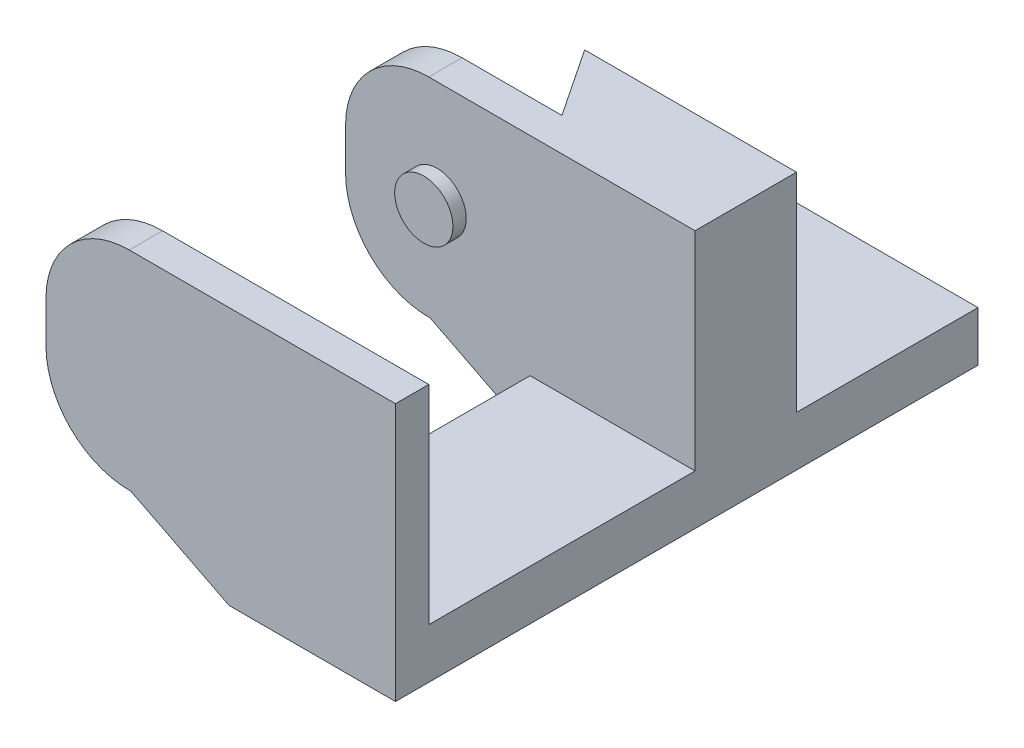
ISO-10303-21;
HEADER;
FILE_DESCRIPTION(('STEP AP214'),'2;1');
FILE_NAME('part.step','',(''),(''),'','','');
FILE_SCHEMA(('AUTOMOTIVE_DESIGN { 1 0 10303 214 1 1 1 1 }'));
ENDSEC;
DATA;
#1=APPLICATION_CONTEXT('core data for automotive mechanical design processes');
#2=APPLICATION_PROTOCOL_DEFINITION('international standard','automotive_design',2000,#1);
#3=PRODUCT_CONTEXT('',#1,'mechanical');
#4=PRODUCT('Part','Part','',(#3));
#5=PRODUCT_RELATED_PRODUCT_CATEGORY('part','',(#4));
#6=PRODUCT_DEFINITION_FORMATION('','',#4);
#7=PRODUCT_DEFINITION_CONTEXT('part definition',#1,'design');
#8=PRODUCT_DEFINITION('design','',#6,#7);
#9=PRODUCT_DEFINITION_SHAPE('','',#8);
#10=(LENGTH_UNIT() NAMED_UNIT(*) SI_UNIT(.MILLI.,.METRE.));
#11=(NAMED_UNIT(*) PLANE_ANGLE_UNIT() SI_UNIT($,.RADIAN.));
#12=(NAMED_UNIT(*) SI_UNIT($,.STERADIAN.) SOLID_ANGLE_UNIT());
#13=UNCERTAINTY_MEASURE_WITH_UNIT(LENGTH_MEASURE(1.E-05),#10,'distance_accuracy_value','');
#14=(GEOMETRIC_REPRESENTATION_CONTEXT(3) GLOBAL_UNCERTAINTY_ASSIGNED_CONTEXT((#13)) GLOBAL_UNIT_ASSIGNED_CONTEXT((#10,
#11,#12)) REPRESENTATION_CONTEXT('',''));
#15=CARTESIAN_POINT('',(0.,0.,0.));
#16=DIRECTION('',(0.,0.,1.));
#17=DIRECTION('',(1.,0.,0.));
#18=AXIS2_PLACEMENT_3D('',#15,#16,#17);
#19=CARTESIAN_POINT('',(0.,0.,10.));
#20=DIRECTION('',(-0.452443953980145,-0.891792839457019,0.));
#21=DIRECTION('',(0.891792839457019,-0.452443953980145,0.));
#22=AXIS2_PLACEMENT_3D('',#19,#20,#21);
#23=PLANE('',#22);
#24=DIRECTION('',(0.891792839457019,-0.452443953980145,0.));
#25=VECTOR('',#24,1.);
#26=CARTESIAN_POINT('',(0.,0.,12.));
#27=LINE('',#26,#25);
#28=CARTESIAN_POINT('',(-5.91317111177147,3.,12.));
#29=VERTEX_POINT('',#28);
#30=CARTESIAN_POINT('',(0.,0.,12.));
#31=VERTEX_POINT('',#30);
#32=EDGE_CURVE('E11',#29,#31,#27,.T.);
#33=ORIENTED_EDGE('',*,*,#32,.F.);
#34=DIRECTION('',(0.,0.,1.));
#35=VECTOR('',#34,1.);
#36=CARTESIAN_POINT('',(-5.91317111177147,3.,10.));
#37=LINE('',#36,#35);
#38=CARTESIAN_POINT('',(-5.91317111177147,3.,10.));
#39=VERTEX_POINT('',#38);
#40=EDGE_CURVE('E221',#39,#29,#37,.T.);
#41=ORIENTED_EDGE('',*,*,#40,.F.);
#42=DIRECTION('',(0.891792839457019,-0.452443953980145,0.));
#43=VECTOR('',#42,1.);
#44=CARTESIAN_POINT('',(0.,0.,10.));
#45=LINE('',#44,#43);
#46=CARTESIAN_POINT('',(0.,0.,10.));
#47=VERTEX_POINT('',#46);
#48=EDGE_CURVE('E218',#39,#47,#45,.T.);
#49=ORIENTED_EDGE('',*,*,#48,.T.);
#50=DIRECTION('',(0.,0.,-1.));
#51=VECTOR('',#50,1.);
#52=CARTESIAN_POINT('',(0.,0.,0.));
#53=LINE('',#52,#51);
#54=EDGE_CURVE('E316',#31,#47,#53,.T.);
#55=ORIENTED_EDGE('',*,*,#54,.F.);
#56=EDGE_LOOP('',(#33,#41,#49,#55));
#57=FACE_BOUND('',#56,.T.);
#58=ADVANCED_FACE('F35',(#57),#23,.T.);
#59=CARTESIAN_POINT('',(-5.5,9.25,7.05025253169417));
#60=DIRECTION('',(0.,0.,1.));
#61=DIRECTION('',(1.,0.,0.));
#62=AXIS2_PLACEMENT_3D('',#59,#60,#61);
#63=CYLINDRICAL_SURFACE('',#62,1.75);
#64=CARTESIAN_POINT('',(-5.5,9.25,12.));
#65=DIRECTION('',(0.,0.,-1.));
#66=DIRECTION('',(-1.,0.,0.));
#67=AXIS2_PLACEMENT_3D('',#64,#65,#66);
#68=CIRCLE('',#67,1.75);
#69=CARTESIAN_POINT('',(-7.25,9.25,12.));
#70=VERTEX_POINT('',#69);
#71=EDGE_CURVE('E225',#70,#70,#68,.F.);
#72=ORIENTED_EDGE('',*,*,#71,.T.);
#73=EDGE_LOOP('',(#72));
#74=FACE_BOUND('',#73,.T.);
#75=CARTESIAN_POINT('',(-5.5,9.25,12.8));
#76=DIRECTION('',(0.,0.,1.));
#77=DIRECTION('',(0.,-1.,0.));
#78=AXIS2_PLACEMENT_3D('',#75,#76,#77);
#79=CIRCLE('',#78,1.75);
#80=CARTESIAN_POINT('',(-5.5,7.5,12.8));
#81=VERTEX_POINT('',#80);
#82=EDGE_CURVE('E229',#81,#81,#79,.F.);
#83=ORIENTED_EDGE('',*,*,#82,.T.);
#84=EDGE_LOOP('',(#83));
#85=FACE_BOUND('',#84,.T.);
#86=ADVANCED_FACE('F445',(#74,#85),#63,.T.);
#87=CARTESIAN_POINT('',(0.,3.,0.));
#88=DIRECTION('',(0.,1.,0.));
#89=DIRECTION('',(0.,0.,1.));
#90=AXIS2_PLACEMENT_3D('',#87,#88,#89);
#91=PLANE('',#90);
#92=DIRECTION('',(0.,0.,-1.));
#93=VECTOR('',#92,1.);
#94=CARTESIAN_POINT('',(0.0868288882285252,3.,12.));
#95=LINE('',#94,#93);
#96=CARTESIAN_POINT('',(0.0868288882285269,3.,28.));
#97=VERTEX_POINT('',#96);
#98=CARTESIAN_POINT('',(0.0868288882285252,3.,12.));
#99=VERTEX_POINT('',#98);
#100=EDGE_CURVE('E209',#97,#99,#95,.T.);
#101=ORIENTED_EDGE('',*,*,#100,.F.);
#102=DIRECTION('',(-1.,0.,0.));
#103=VECTOR('',#102,1.);
#104=CARTESIAN_POINT('',(0.,3.,28.));
#105=LINE('',#104,#103);
#106=CARTESIAN_POINT('',(10.,3.,28.));
#107=VERTEX_POINT('',#106);
#108=EDGE_CURVE('E191',#107,#97,#105,.T.);
#109=ORIENTED_EDGE('',*,*,#108,.F.);
#110=DIRECTION('',(0.,0.,-1.));
#111=VECTOR('',#110,1.);
#112=CARTESIAN_POINT('',(9.99999999999999,3.,0.));
#113=LINE('',#112,#111);
#114=CARTESIAN_POINT('',(9.99999999999999,3.,12.));
#115=VERTEX_POINT('',#114);
#116=EDGE_CURVE('E302',#107,#115,#113,.T.);
#117=ORIENTED_EDGE('',*,*,#116,.T.);
#118=DIRECTION('',(-1.,0.,0.));
#119=VECTOR('',#118,1.);
#120=CARTESIAN_POINT('',(0.,3.,12.));
#121=LINE('',#120,#119);
#122=EDGE_CURVE('E281',#115,#99,#121,.T.);
#123=ORIENTED_EDGE('',*,*,#122,.T.);
#124=EDGE_LOOP('',(#101,#109,#117,#123));
#125=FACE_BOUND('',#124,.T.);
#126=ADVANCED_FACE('F409',(#125),#91,.T.);
#127=CARTESIAN_POINT('',(-4.61538461538462,3.,3.07692307692308));
#128=DIRECTION('',(-0.832050294337843,0.,0.554700196225229));
#129=DIRECTION('',(0.554700196225229,0.,0.832050294337844));
#130=AXIS2_PLACEMENT_3D('',#127,#128,#129);
#131=PLANE('',#130);
#132=DIRECTION('',(-0.554700196225229,0.,-0.832050294337844));
#133=VECTOR('',#132,1.);
#134=CARTESIAN_POINT('',(-4.61538461538462,0.,3.07692307692308));
#135=LINE('',#134,#133);
#136=CARTESIAN_POINT('',(-6.37657114477363,0.,0.435143282839558));
#137=VERTEX_POINT('',#136);
#138=EDGE_CURVE('E313',#47,#137,#135,.T.);
#139=ORIENTED_EDGE('',*,*,#138,.F.);
#140=DIRECTION('',(0.,-1.,0.));
#141=VECTOR('',#140,1.);
#142=CARTESIAN_POINT('',(0.,3.,10.));
#143=LINE('',#142,#141);
#144=CARTESIAN_POINT('',(0.,15.5,10.));
#145=VERTEX_POINT('',#144);
#146=EDGE_CURVE('E234',#145,#47,#143,.T.);
#147=ORIENTED_EDGE('',*,*,#146,.F.);
#148=DIRECTION('',(0.554700196225229,0.,0.832050294337844));
#149=VECTOR('',#148,1.);
#150=CARTESIAN_POINT('',(-4.61538461538462,15.5,3.07692307692308));
#151=LINE('',#150,#149);
#152=CARTESIAN_POINT('',(-2.72942852412894,15.5,5.90585721380659));
#153=VERTEX_POINT('',#152);
#154=EDGE_CURVE('E262',#153,#145,#151,.T.);
#155=ORIENTED_EDGE('',*,*,#154,.F.);
#156=DIRECTION('',(0.,-1.,0.));
#157=VECTOR('',#156,1.);
#158=CARTESIAN_POINT('',(-2.72942852412894,28.8716250210903,5.90585721380659));
#159=LINE('',#158,#157);
#160=CARTESIAN_POINT('',(-2.72942852412894,3.,5.90585721380659));
#161=VERTEX_POINT('',#160);
#162=EDGE_CURVE('E263',#153,#161,#159,.T.);
#163=ORIENTED_EDGE('',*,*,#162,.T.);
#164=DIRECTION('',(-0.554700196225229,0.,-0.832050294337844));
#165=VECTOR('',#164,1.);
#166=CARTESIAN_POINT('',(-4.61538461538462,3.,3.07692307692308));
#167=LINE('',#166,#165);
#168=CARTESIAN_POINT('',(-6.37657114477363,3.,0.435143282839558));
#169=VERTEX_POINT('',#168);
#170=EDGE_CURVE('E298',#161,#169,#167,.T.);
#171=ORIENTED_EDGE('',*,*,#170,.T.);
#172=DIRECTION('',(0.,-1.,0.));
#173=VECTOR('',#172,1.);
#174=CARTESIAN_POINT('',(-6.37657114477363,3.,0.435143282839558));
#175=LINE('',#174,#173);
#176=EDGE_CURVE('E310',#169,#137,#175,.T.);
#177=ORIENTED_EDGE('',*,*,#176,.T.);
#178=EDGE_LOOP('',(#139,#147,#155,#163,#171,#177));
#179=FACE_BOUND('',#178,.T.);
#180=ADVANCED_FACE('F422',(#179),#131,.T.);
#181=CARTESIAN_POINT('',(0.,3.,30.));
#182=DIRECTION('',(0.,0.,-1.));
#183=DIRECTION('',(-1.,0.,0.));
#184=AXIS2_PLACEMENT_3D('',#181,#182,#183);
#185=PLANE('',#184);
#186=DIRECTION('',(0.891792839457019,-0.452443953980145,0.));
#187=VECTOR('',#186,1.);
#188=CARTESIAN_POINT('',(0.,0.,30.));
#189=LINE('',#188,#187);
#190=CARTESIAN_POINT('',(-5.91317111177147,3.,30.));
#191=VERTEX_POINT('',#190);
#192=CARTESIAN_POINT('',(0.,0.,30.));
#193=VERTEX_POINT('',#192);
#194=EDGE_CURVE('E214',#191,#193,#189,.T.);
#195=ORIENTED_EDGE('',*,*,#194,.T.);
#196=DIRECTION('',(1.,0.,0.));
#197=VECTOR('',#196,1.);
#198=CARTESIAN_POINT('',(0.,0.,30.));
#199=LINE('',#198,#197);
#200=CARTESIAN_POINT('',(10.,0.,30.));
#201=VERTEX_POINT('',#200);
#202=EDGE_CURVE('E318',#193,#201,#199,.T.);
#203=ORIENTED_EDGE('',*,*,#202,.T.);
#204=DIRECTION('',(0.,-1.,0.));
#205=VECTOR('',#204,1.);
#206=CARTESIAN_POINT('',(10.,3.,30.));
#207=LINE('',#206,#205);
#208=CARTESIAN_POINT('',(10.,15.5,30.));
#209=VERTEX_POINT('',#208);
#210=EDGE_CURVE('E334',#209,#201,#207,.T.);
#211=ORIENTED_EDGE('',*,*,#210,.F.);
#212=DIRECTION('',(1.,0.,0.));
#213=VECTOR('',#212,1.);
#214=CARTESIAN_POINT('',(0.,15.5,30.));
#215=LINE('',#214,#213);
#216=CARTESIAN_POINT('',(-6.,15.5,30.));
#217=VERTEX_POINT('',#216);
#218=EDGE_CURVE('E286',#217,#209,#215,.T.);
#219=ORIENTED_EDGE('',*,*,#218,.F.);
#220=CARTESIAN_POINT('',(-6.,10.5,30.));
#221=DIRECTION('',(0.,0.,-1.));
#222=DIRECTION('',(-1.,0.,0.));
#223=AXIS2_PLACEMENT_3D('',#220,#221,#222);
#224=CIRCLE('',#223,5.);
#225=CARTESIAN_POINT('',(-11.,10.5,30.));
#226=VERTEX_POINT('',#225);
#227=EDGE_CURVE('E373',#217,#226,#224,.F.);
#228=ORIENTED_EDGE('',*,*,#227,.T.);
#229=DIRECTION('',(0.,1.,0.));
#230=VECTOR('',#229,1.);
#231=CARTESIAN_POINT('',(-11.,3.,30.));
#232=LINE('',#231,#230);
#233=CARTESIAN_POINT('',(-11.,8.,30.));
#234=VERTEX_POINT('',#233);
#235=EDGE_CURVE('E237',#234,#226,#232,.T.);
#236=ORIENTED_EDGE('',*,*,#235,.F.);
#237=CARTESIAN_POINT('',(-6.,8.,30.));
#238=DIRECTION('',(0.,0.,-1.));
#239=DIRECTION('',(-1.,0.,0.));
#240=AXIS2_PLACEMENT_3D('',#237,#238,#239);
#241=CIRCLE('',#240,5.);
#242=CARTESIAN_POINT('',(-6.,3.,30.));
#243=VERTEX_POINT('',#242);
#244=EDGE_CURVE('E58',#234,#243,#241,.F.);
#245=ORIENTED_EDGE('',*,*,#244,.T.);
#246=DIRECTION('',(1.,0.,0.));
#247=VECTOR('',#246,1.);
#248=CARTESIAN_POINT('',(-11.,3.,30.));
#249=LINE('',#248,#247);
#250=EDGE_CURVE('E240',#243,#191,#249,.T.);
#251=ORIENTED_EDGE('',*,*,#250,.T.);
#252=EDGE_LOOP('',(#195,#203,#211,#219,#228,#236,#245,#251));
#253=FACE_BOUND('',#252,.T.);
#254=ADVANCED_FACE('F433',(#253),#185,.F.);
#255=CARTESIAN_POINT('',(9.99999999999999,3.,0.));
#256=DIRECTION('',(-1.,0.,0.));
#257=DIRECTION('',(0.,0.,1.));
#258=AXIS2_PLACEMENT_3D('',#255,#256,#257);
#259=PLANE('',#258);
#260=CARTESIAN_POINT('',(9.99999999999999,3.,5.90585721380659));
#261=VERTEX_POINT('',#260);
#262=CARTESIAN_POINT('',(9.99999999999999,3.,-5.));
#263=VERTEX_POINT('',#262);
#264=EDGE_CURVE('E301',#261,#263,#113,.T.);
#265=ORIENTED_EDGE('',*,*,#264,.F.);
#266=DIRECTION('',(0.,-1.,0.));
#267=VECTOR('',#266,1.);
#268=CARTESIAN_POINT('',(9.99999999999999,28.8716250210903,5.90585721380659));
#269=LINE('',#268,#267);
#270=CARTESIAN_POINT('',(9.99999999999999,15.5,5.90585721380659));
#271=VERTEX_POINT('',#270);
#272=EDGE_CURVE('E269',#271,#261,#269,.T.);
#273=ORIENTED_EDGE('',*,*,#272,.F.);
#274=DIRECTION('',(0.,0.,1.));
#275=VECTOR('',#274,1.);
#276=CARTESIAN_POINT('',(9.99999999999999,15.5,0.));
#277=LINE('',#276,#275);
#278=CARTESIAN_POINT('',(9.99999999999999,15.5,12.));
#279=VERTEX_POINT('',#278);
#280=EDGE_CURVE('E275',#271,#279,#277,.T.);
#281=ORIENTED_EDGE('',*,*,#280,.T.);
#282=DIRECTION('',(0.,-1.,0.));
#283=VECTOR('',#282,1.);
#284=CARTESIAN_POINT('',(9.99999999999999,15.5,12.));
#285=LINE('',#284,#283);
#286=EDGE_CURVE('E278',#279,#115,#285,.T.);
#287=ORIENTED_EDGE('',*,*,#286,.T.);
#288=ORIENTED_EDGE('',*,*,#116,.F.);
#289=DIRECTION('',(0.,-1.,0.));
#290=VECTOR('',#289,1.);
#291=CARTESIAN_POINT('',(10.,15.5,28.));
#292=LINE('',#291,#290);
#293=CARTESIAN_POINT('',(10.,15.5,28.));
#294=VERTEX_POINT('',#293);
#295=EDGE_CURVE('E291',#294,#107,#292,.T.);
#296=ORIENTED_EDGE('',*,*,#295,.F.);
#297=DIRECTION('',(0.,0.,1.));
#298=VECTOR('',#297,1.);
#299=CARTESIAN_POINT('',(10.,15.5,0.));
#300=LINE('',#299,#298);
#301=EDGE_CURVE('E288',#294,#209,#300,.T.);
#302=ORIENTED_EDGE('',*,*,#301,.T.);
#303=ORIENTED_EDGE('',*,*,#210,.T.);
#304=DIRECTION('',(0.,0.,-1.));
#305=VECTOR('',#304,1.);
#306=CARTESIAN_POINT('',(9.99999999999999,0.,0.));
#307=LINE('',#306,#305);
#308=CARTESIAN_POINT('',(9.99999999999999,0.,-5.));
#309=VERTEX_POINT('',#308);
#310=EDGE_CURVE('E321',#201,#309,#307,.T.);
#311=ORIENTED_EDGE('',*,*,#310,.T.);
#312=DIRECTION('',(0.,-1.,0.));
#313=VECTOR('',#312,1.);
#314=CARTESIAN_POINT('',(9.99999999999999,3.,-5.));
#315=LINE('',#314,#313);
#316=EDGE_CURVE('E331',#263,#309,#315,.T.);
#317=ORIENTED_EDGE('',*,*,#316,.F.);
#318=EDGE_LOOP('',(#265,#273,#281,#287,#288,#296,#302,#303,#311,#317));
#319=FACE_BOUND('',#318,.T.);
#320=ADVANCED_FACE('F405',(#319),#259,.F.);
#321=CARTESIAN_POINT('',(0.,3.,-5.));
#322=DIRECTION('',(0.,0.,-1.));
#323=DIRECTION('',(-1.,0.,0.));
#324=AXIS2_PLACEMENT_3D('',#321,#322,#323);
#325=PLANE('',#324);
#326=DIRECTION('',(1.,0.,0.));
#327=VECTOR('',#326,1.);
#328=CARTESIAN_POINT('',(0.,0.,-5.));
#329=LINE('',#328,#327);
#330=CARTESIAN_POINT('',(-6.37657114477364,0.,-5.));
#331=VERTEX_POINT('',#330);
#332=EDGE_CURVE('E323',#331,#309,#329,.T.);
#333=ORIENTED_EDGE('',*,*,#332,.F.);
#334=DIRECTION('',(0.,-1.,0.));
#335=VECTOR('',#334,1.);
#336=CARTESIAN_POINT('',(-6.37657114477364,3.,-5.));
#337=LINE('',#336,#335);
#338=CARTESIAN_POINT('',(-6.37657114477364,3.,-5.));
#339=VERTEX_POINT('',#338);
#340=EDGE_CURVE('E329',#339,#331,#337,.T.);
#341=ORIENTED_EDGE('',*,*,#340,.F.);
#342=DIRECTION('',(1.,0.,0.));
#343=VECTOR('',#342,1.);
#344=CARTESIAN_POINT('',(0.,3.,-5.));
#345=LINE('',#344,#343);
#346=EDGE_CURVE('E304',#339,#263,#345,.T.);
#347=ORIENTED_EDGE('',*,*,#346,.T.);
#348=ORIENTED_EDGE('',*,*,#316,.T.);
#349=EDGE_LOOP('',(#333,#341,#347,#348));
#350=FACE_BOUND('',#349,.T.);
#351=ADVANCED_FACE('F428',(#350),#325,.T.);
#352=CARTESIAN_POINT('',(1.81171442761318,3.,0.905857213806591));
#353=DIRECTION('',(0.,-1.,0.));
#354=DIRECTION('',(0.,0.,-1.));
#355=AXIS2_PLACEMENT_3D('',#352,#353,#354);
#356=CYLINDRICAL_SURFACE('',#355,2.);
#357=CARTESIAN_POINT('',(1.81171442761318,3.,0.905857213806591));
#358=DIRECTION('',(0.,1.,0.));
#359=DIRECTION('',(0.,0.,1.));
#360=AXIS2_PLACEMENT_3D('',#357,#358,#359);
#361=CIRCLE('',#360,2.);
#362=CARTESIAN_POINT('',(1.81171442761318,3.,2.90585721380659));
#363=VERTEX_POINT('',#362);
#364=EDGE_CURVE('E295',#363,#363,#361,.T.);
#365=ORIENTED_EDGE('',*,*,#364,.T.);
#366=EDGE_LOOP('',(#365));
#367=FACE_BOUND('',#366,.T.);
#368=CARTESIAN_POINT('',(1.81171442761318,0.,0.905857213806591));
#369=DIRECTION('',(0.,1.,0.));
#370=DIRECTION('',(0.,0.,1.));
#371=AXIS2_PLACEMENT_3D('',#368,#369,#370);
#372=CIRCLE('',#371,2.);
#373=CARTESIAN_POINT('',(1.81171442761318,0.,2.90585721380659));
#374=VERTEX_POINT('',#373);
#375=EDGE_CURVE('E294',#374,#374,#372,.T.);
#376=ORIENTED_EDGE('',*,*,#375,.F.);
#377=EDGE_LOOP('',(#376));
#378=FACE_BOUND('',#377,.T.);
#379=ADVANCED_FACE('F476',(#367,#378),#356,.F.);
#380=CARTESIAN_POINT('',(-6.37657114477363,3.,0.));
#381=DIRECTION('',(1.,0.,0.));
#382=DIRECTION('',(0.,0.,-1.));
#383=AXIS2_PLACEMENT_3D('',#380,#381,#382);
#384=PLANE('',#383);
#385=DIRECTION('',(0.,0.,1.));
#386=VECTOR('',#385,1.);
#387=CARTESIAN_POINT('',(-6.37657114477363,0.,0.));
#388=LINE('',#387,#386);
#389=EDGE_CURVE('E299',#331,#137,#388,.T.);
#390=ORIENTED_EDGE('',*,*,#389,.T.);
#391=ORIENTED_EDGE('',*,*,#176,.F.);
#392=DIRECTION('',(0.,0.,1.));
#393=VECTOR('',#392,1.);
#394=CARTESIAN_POINT('',(-6.37657114477363,3.,0.));
#395=LINE('',#394,#393);
#396=EDGE_CURVE('E307',#339,#169,#395,.T.);
#397=ORIENTED_EDGE('',*,*,#396,.F.);
#398=ORIENTED_EDGE('',*,*,#340,.T.);
#399=EDGE_LOOP('',(#390,#391,#397,#398));
#400=FACE_BOUND('',#399,.T.);
#401=ADVANCED_FACE('F478',(#400),#384,.F.);
#402=DIRECTION('',(1.,0.,0.));
#403=VECTOR('',#402,1.);
#404=CARTESIAN_POINT('',(0.,3.,5.90585721380659));
#405=LINE('',#404,#403);
#406=EDGE_CURVE('E260',#161,#261,#405,.T.);
#407=ORIENTED_EDGE('',*,*,#406,.T.);
#408=ORIENTED_EDGE('',*,*,#264,.T.);
#409=ORIENTED_EDGE('',*,*,#346,.F.);
#410=ORIENTED_EDGE('',*,*,#396,.T.);
#411=ORIENTED_EDGE('',*,*,#170,.F.);
#412=EDGE_LOOP('',(#407,#408,#409,#410,#411));
#413=FACE_BOUND('',#412,.T.);
#414=ORIENTED_EDGE('',*,*,#364,.F.);
#415=EDGE_LOOP('',(#414));
#416=FACE_BOUND('',#415,.T.);
#417=ADVANCED_FACE('F484',(#413,#416),#91,.T.);
#418=CARTESIAN_POINT('',(0.,0.,0.));
#419=DIRECTION('',(0.,1.,0.));
#420=DIRECTION('',(0.,0.,1.));
#421=AXIS2_PLACEMENT_3D('',#418,#419,#420);
#422=PLANE('',#421);
#423=ORIENTED_EDGE('',*,*,#375,.T.);
#424=EDGE_LOOP('',(#423));
#425=FACE_BOUND('',#424,.T.);
#426=DIRECTION('',(0.,0.,-1.));
#427=VECTOR('',#426,1.);
#428=CARTESIAN_POINT('',(0.0868288882285252,0.,12.));
#429=LINE('',#428,#427);
#430=CARTESIAN_POINT('',(0.0868288882285269,0.,28.));
#431=VERTEX_POINT('',#430);
#432=CARTESIAN_POINT('',(0.0868288882285252,0.,12.));
#433=VERTEX_POINT('',#432);
#434=EDGE_CURVE('E199',#431,#433,#429,.T.);
#435=ORIENTED_EDGE('',*,*,#434,.T.);
#436=DIRECTION('',(-1.,0.,0.));
#437=VECTOR('',#436,1.);
#438=CARTESIAN_POINT('',(-5.91317111177147,0.,12.));
#439=LINE('',#438,#437);
#440=EDGE_CURVE('E196',#433,#31,#439,.T.);
#441=ORIENTED_EDGE('',*,*,#440,.T.);
#442=ORIENTED_EDGE('',*,*,#54,.T.);
#443=ORIENTED_EDGE('',*,*,#138,.T.);
#444=ORIENTED_EDGE('',*,*,#389,.F.);
#445=ORIENTED_EDGE('',*,*,#332,.T.);
#446=ORIENTED_EDGE('',*,*,#310,.F.);
#447=ORIENTED_EDGE('',*,*,#202,.F.);
#448=CARTESIAN_POINT('',(0.,0.,28.));
#449=VERTEX_POINT('',#448);
#450=EDGE_CURVE('E208',#193,#449,#53,.T.);
#451=ORIENTED_EDGE('',*,*,#450,.T.);
#452=DIRECTION('',(1.,0.,0.));
#453=VECTOR('',#452,1.);
#454=CARTESIAN_POINT('',(-5.91317111177147,0.,28.));
#455=LINE('',#454,#453);
#456=EDGE_CURVE('E50',#449,#431,#455,.T.);
#457=ORIENTED_EDGE('',*,*,#456,.T.);
#458=EDGE_LOOP('',(#435,#441,#442,#443,#444,#445,#446,#447,#451,#457));
#459=FACE_BOUND('',#458,.T.);
#460=ADVANCED_FACE('F206',(#425,#459),#422,.F.);
#461=CARTESIAN_POINT('',(0.,15.5,28.));
#462=DIRECTION('',(0.,0.,-1.));
#463=DIRECTION('',(-1.,0.,0.));
#464=AXIS2_PLACEMENT_3D('',#461,#462,#463);
#465=PLANE('',#464);
#466=CARTESIAN_POINT('',(-5.5,9.25,28.));
#467=DIRECTION('',(0.,0.,-1.));
#468=DIRECTION('',(-1.,0.,0.));
#469=AXIS2_PLACEMENT_3D('',#466,#467,#468);
#470=CIRCLE('',#469,1.75);
#471=CARTESIAN_POINT('',(-7.25,9.25,28.));
#472=VERTEX_POINT('',#471);
#473=EDGE_CURVE('E230',#472,#472,#470,.T.);
#474=ORIENTED_EDGE('',*,*,#473,.F.);
#475=EDGE_LOOP('',(#474));
#476=FACE_BOUND('',#475,.T.);
#477=DIRECTION('',(0.,-1.,0.));
#478=VECTOR('',#477,1.);
#479=CARTESIAN_POINT('',(-11.,3.,28.));
#480=LINE('',#479,#478);
#481=CARTESIAN_POINT('',(-11.,10.5,28.));
#482=VERTEX_POINT('',#481);
#483=CARTESIAN_POINT('',(-11.,8.,28.));
#484=VERTEX_POINT('',#483);
#485=EDGE_CURVE('E228',#482,#484,#480,.T.);
#486=ORIENTED_EDGE('',*,*,#485,.F.);
#487=CARTESIAN_POINT('',(-6.,10.5,28.));
#488=DIRECTION('',(0.,0.,-1.));
#489=DIRECTION('',(-1.,0.,0.));
#490=AXIS2_PLACEMENT_3D('',#487,#488,#489);
#491=CIRCLE('',#490,5.);
#492=CARTESIAN_POINT('',(-6.,15.5,28.));
#493=VERTEX_POINT('',#492);
#494=EDGE_CURVE('E368',#482,#493,#491,.T.);
#495=ORIENTED_EDGE('',*,*,#494,.T.);
#496=DIRECTION('',(1.,0.,0.));
#497=VECTOR('',#496,1.);
#498=CARTESIAN_POINT('',(0.,15.5,28.));
#499=LINE('',#498,#497);
#500=EDGE_CURVE('E284',#493,#294,#499,.T.);
#501=ORIENTED_EDGE('',*,*,#500,.T.);
#502=ORIENTED_EDGE('',*,*,#295,.T.);
#503=ORIENTED_EDGE('',*,*,#108,.T.);
#504=DIRECTION('',(0.,1.,0.));
#505=VECTOR('',#504,1.);
#506=CARTESIAN_POINT('',(0.0868288882285269,0.,28.));
#507=LINE('',#506,#505);
#508=EDGE_CURVE('E185',#431,#97,#507,.T.);
#509=ORIENTED_EDGE('',*,*,#508,.F.);
#510=ORIENTED_EDGE('',*,*,#456,.F.);
#511=DIRECTION('',(-0.891792839457019,0.452443953980145,0.));
#512=VECTOR('',#511,1.);
#513=CARTESIAN_POINT('',(0.,0.,28.));
#514=LINE('',#513,#512);
#515=CARTESIAN_POINT('',(-5.91317111177147,3.,28.));
#516=VERTEX_POINT('',#515);
#517=EDGE_CURVE('E43',#449,#516,#514,.T.);
#518=ORIENTED_EDGE('',*,*,#517,.T.);
#519=DIRECTION('',(1.,0.,0.));
#520=VECTOR('',#519,1.);
#521=CARTESIAN_POINT('',(-11.,3.,28.));
#522=LINE('',#521,#520);
#523=CARTESIAN_POINT('',(-6.,3.,28.));
#524=VERTEX_POINT('',#523);
#525=EDGE_CURVE('E242',#524,#516,#522,.T.);
#526=ORIENTED_EDGE('',*,*,#525,.F.);
#527=CARTESIAN_POINT('',(-6.,8.,28.));
#528=DIRECTION('',(0.,0.,-1.));
#529=DIRECTION('',(-1.,0.,0.));
#530=AXIS2_PLACEMENT_3D('',#527,#528,#529);
#531=CIRCLE('',#530,5.);
#532=EDGE_CURVE('E366',#524,#484,#531,.T.);
#533=ORIENTED_EDGE('',*,*,#532,.T.);
#534=EDGE_LOOP('',(#486,#495,#501,#502,#503,#509,#510,#518,#526,#533));
#535=FACE_BOUND('',#534,.T.);
#536=ADVANCED_FACE('F188',(#476,#535),#465,.T.);
#537=CARTESIAN_POINT('',(0.,15.5,0.));
#538=DIRECTION('',(0.,1.,0.));
#539=DIRECTION('',(0.,0.,1.));
#540=AXIS2_PLACEMENT_3D('',#537,#538,#539);
#541=PLANE('',#540);
#542=ORIENTED_EDGE('',*,*,#500,.F.);
#543=DIRECTION('',(0.,0.,-1.));
#544=VECTOR('',#543,1.);
#545=CARTESIAN_POINT('',(-6.,15.5,30.));
#546=LINE('',#545,#544);
#547=EDGE_CURVE('E370',#493,#217,#546,.F.);
#548=ORIENTED_EDGE('',*,*,#547,.T.);
#549=ORIENTED_EDGE('',*,*,#218,.T.);
#550=ORIENTED_EDGE('',*,*,#301,.F.);
#551=EDGE_LOOP('',(#542,#548,#549,#550));
#552=FACE_BOUND('',#551,.T.);
#553=ADVANCED_FACE('F400',(#552),#541,.T.);
#554=CARTESIAN_POINT('',(0.,15.5,12.));
#555=DIRECTION('',(0.,0.,-1.));
#556=DIRECTION('',(-1.,0.,0.));
#557=AXIS2_PLACEMENT_3D('',#554,#555,#556);
#558=PLANE('',#557);
#559=ORIENTED_EDGE('',*,*,#71,.F.);
#560=EDGE_LOOP('',(#559));
#561=FACE_BOUND('',#560,.T.);
#562=DIRECTION('',(0.,1.,0.));
#563=VECTOR('',#562,1.);
#564=CARTESIAN_POINT('',(-11.,3.,12.));
#565=LINE('',#564,#563);
#566=CARTESIAN_POINT('',(-11.,8.,12.));
#567=VERTEX_POINT('',#566);
#568=CARTESIAN_POINT('',(-11.,10.5,12.));
#569=VERTEX_POINT('',#568);
#570=EDGE_CURVE('E245',#567,#569,#565,.T.);
#571=ORIENTED_EDGE('',*,*,#570,.F.);
#572=CARTESIAN_POINT('',(-6.,8.,12.));
#573=DIRECTION('',(0.,0.,-1.));
#574=DIRECTION('',(-1.,0.,0.));
#575=AXIS2_PLACEMENT_3D('',#572,#573,#574);
#576=CIRCLE('',#575,5.);
#577=CARTESIAN_POINT('',(-6.,3.,12.));
#578=VERTEX_POINT('',#577);
#579=EDGE_CURVE('E350',#567,#578,#576,.F.);
#580=ORIENTED_EDGE('',*,*,#579,.T.);
#581=DIRECTION('',(1.,0.,0.));
#582=VECTOR('',#581,1.);
#583=CARTESIAN_POINT('',(-11.,3.,12.));
#584=LINE('',#583,#582);
#585=EDGE_CURVE('E251',#578,#29,#584,.T.);
#586=ORIENTED_EDGE('',*,*,#585,.T.);
#587=ORIENTED_EDGE('',*,*,#32,.T.);
#588=ORIENTED_EDGE('',*,*,#440,.F.);
#589=DIRECTION('',(0.,1.,0.));
#590=VECTOR('',#589,1.);
#591=CARTESIAN_POINT('',(0.0868288882285252,0.,12.));
#592=LINE('',#591,#590);
#593=EDGE_CURVE('E195',#433,#99,#592,.T.);
#594=ORIENTED_EDGE('',*,*,#593,.T.);
#595=ORIENTED_EDGE('',*,*,#122,.F.);
#596=ORIENTED_EDGE('',*,*,#286,.F.);
#597=DIRECTION('',(1.,0.,0.));
#598=VECTOR('',#597,1.);
#599=CARTESIAN_POINT('',(0.,15.5,12.));
#600=LINE('',#599,#598);
#601=CARTESIAN_POINT('',(-6.,15.5,12.));
#602=VERTEX_POINT('',#601);
#603=EDGE_CURVE('E266',#602,#279,#600,.T.);
#604=ORIENTED_EDGE('',*,*,#603,.F.);
#605=CARTESIAN_POINT('',(-6.,10.5,12.));
#606=DIRECTION('',(0.,0.,-1.));
#607=DIRECTION('',(-1.,0.,0.));
#608=AXIS2_PLACEMENT_3D('',#605,#606,#607);
#609=CIRCLE('',#608,5.);
#610=EDGE_CURVE('E348',#602,#569,#609,.F.);
#611=ORIENTED_EDGE('',*,*,#610,.T.);
#612=EDGE_LOOP('',(#571,#580,#586,#587,#588,#594,#595,#596,#604,#611));
#613=FACE_BOUND('',#612,.T.);
#614=ADVANCED_FACE('F412',(#561,#613),#558,.F.);
#615=CARTESIAN_POINT('',(0.,15.5,0.));
#616=DIRECTION('',(0.,1.,0.));
#617=DIRECTION('',(0.,0.,1.));
#618=AXIS2_PLACEMENT_3D('',#615,#616,#617);
#619=PLANE('',#618);
#620=DIRECTION('',(1.,0.,0.));
#621=VECTOR('',#620,1.);
#622=CARTESIAN_POINT('',(-11.,15.5,10.));
#623=LINE('',#622,#621);
#624=CARTESIAN_POINT('',(-6.,15.5,10.));
#625=VERTEX_POINT('',#624);
#626=EDGE_CURVE('E257',#625,#145,#623,.T.);
#627=ORIENTED_EDGE('',*,*,#626,.F.);
#628=DIRECTION('',(0.,0.,-1.));
#629=VECTOR('',#628,1.);
#630=CARTESIAN_POINT('',(-6.,15.5,0.));
#631=LINE('',#630,#629);
#632=EDGE_CURVE('E358',#625,#602,#631,.F.);
#633=ORIENTED_EDGE('',*,*,#632,.T.);
#634=ORIENTED_EDGE('',*,*,#603,.T.);
#635=ORIENTED_EDGE('',*,*,#280,.F.);
#636=DIRECTION('',(1.,0.,0.));
#637=VECTOR('',#636,1.);
#638=CARTESIAN_POINT('',(0.,15.5,5.90585721380659));
#639=LINE('',#638,#637);
#640=EDGE_CURVE('E259',#153,#271,#639,.T.);
#641=ORIENTED_EDGE('',*,*,#640,.F.);
#642=ORIENTED_EDGE('',*,*,#154,.T.);
#643=EDGE_LOOP('',(#627,#633,#634,#635,#641,#642));
#644=FACE_BOUND('',#643,.T.);
#645=ADVANCED_FACE('F507',(#644),#619,.T.);
#646=CARTESIAN_POINT('',(0.,28.8716250210903,5.90585721380659));
#647=DIRECTION('',(0.,0.,-1.));
#648=DIRECTION('',(-1.,0.,0.));
#649=AXIS2_PLACEMENT_3D('',#646,#647,#648);
#650=PLANE('',#649);
#651=ORIENTED_EDGE('',*,*,#162,.F.);
#652=ORIENTED_EDGE('',*,*,#640,.T.);
#653=ORIENTED_EDGE('',*,*,#272,.T.);
#654=ORIENTED_EDGE('',*,*,#406,.F.);
#655=EDGE_LOOP('',(#651,#652,#653,#654));
#656=FACE_BOUND('',#655,.T.);
#657=ADVANCED_FACE('F511',(#656),#650,.T.);
#658=CARTESIAN_POINT('',(-11.,3.,10.));
#659=DIRECTION('',(0.,0.,1.));
#660=DIRECTION('',(1.,0.,0.));
#661=AXIS2_PLACEMENT_3D('',#658,#659,#660);
#662=PLANE('',#661);
#663=DIRECTION('',(1.,0.,0.));
#664=VECTOR('',#663,1.);
#665=CARTESIAN_POINT('',(-11.,3.,10.));
#666=LINE('',#665,#664);
#667=CARTESIAN_POINT('',(-6.,3.,10.));
#668=VERTEX_POINT('',#667);
#669=EDGE_CURVE('E254',#668,#39,#666,.T.);
#670=ORIENTED_EDGE('',*,*,#669,.F.);
#671=CARTESIAN_POINT('',(-6.,8.,10.));
#672=DIRECTION('',(0.,0.,1.));
#673=DIRECTION('',(1.,0.,0.));
#674=AXIS2_PLACEMENT_3D('',#671,#672,#673);
#675=CIRCLE('',#674,5.);
#676=CARTESIAN_POINT('',(-11.,8.,10.));
#677=VERTEX_POINT('',#676);
#678=EDGE_CURVE('E356',#668,#677,#675,.F.);
#679=ORIENTED_EDGE('',*,*,#678,.T.);
#680=DIRECTION('',(0.,-1.,0.));
#681=VECTOR('',#680,1.);
#682=CARTESIAN_POINT('',(-11.,3.,10.));
#683=LINE('',#682,#681);
#684=CARTESIAN_POINT('',(-11.,10.5,10.));
#685=VERTEX_POINT('',#684);
#686=EDGE_CURVE('E248',#685,#677,#683,.T.);
#687=ORIENTED_EDGE('',*,*,#686,.F.);
#688=CARTESIAN_POINT('',(-6.,10.5,10.));
#689=DIRECTION('',(0.,0.,1.));
#690=DIRECTION('',(1.,0.,0.));
#691=AXIS2_PLACEMENT_3D('',#688,#689,#690);
#692=CIRCLE('',#691,5.);
#693=EDGE_CURVE('E354',#685,#625,#692,.F.);
#694=ORIENTED_EDGE('',*,*,#693,.T.);
#695=ORIENTED_EDGE('',*,*,#626,.T.);
#696=ORIENTED_EDGE('',*,*,#146,.T.);
#697=ORIENTED_EDGE('',*,*,#48,.F.);
#698=EDGE_LOOP('',(#670,#679,#687,#694,#695,#696,#697));
#699=FACE_BOUND('',#698,.T.);
#700=ADVANCED_FACE('F515',(#699),#662,.F.);
#701=CARTESIAN_POINT('',(-11.,3.,12.));
#702=DIRECTION('',(0.,1.,0.));
#703=DIRECTION('',(0.,0.,1.));
#704=AXIS2_PLACEMENT_3D('',#701,#702,#703);
#705=PLANE('',#704);
#706=ORIENTED_EDGE('',*,*,#669,.T.);
#707=ORIENTED_EDGE('',*,*,#40,.T.);
#708=ORIENTED_EDGE('',*,*,#585,.F.);
#709=DIRECTION('',(0.,0.,1.));
#710=VECTOR('',#709,1.);
#711=CARTESIAN_POINT('',(-6.,3.,10.));
#712=LINE('',#711,#710);
#713=EDGE_CURVE('E352',#578,#668,#712,.F.);
#714=ORIENTED_EDGE('',*,*,#713,.T.);
#715=EDGE_LOOP('',(#706,#707,#708,#714));
#716=FACE_BOUND('',#715,.T.);
#717=ADVANCED_FACE('F518',(#716),#705,.F.);
#718=CARTESIAN_POINT('',(-11.,0.,0.));
#719=DIRECTION('',(-1.,0.,0.));
#720=DIRECTION('',(0.,0.,1.));
#721=AXIS2_PLACEMENT_3D('',#718,#719,#720);
#722=PLANE('',#721);
#723=ORIENTED_EDGE('',*,*,#686,.T.);
#724=DIRECTION('',(0.,0.,1.));
#725=VECTOR('',#724,1.);
#726=CARTESIAN_POINT('',(-11.,8.,12.));
#727=LINE('',#726,#725);
#728=EDGE_CURVE('E345',#677,#567,#727,.T.);
#729=ORIENTED_EDGE('',*,*,#728,.T.);
#730=ORIENTED_EDGE('',*,*,#570,.T.);
#731=DIRECTION('',(0.,0.,-1.));
#732=VECTOR('',#731,1.);
#733=CARTESIAN_POINT('',(-11.,10.5,0.));
#734=LINE('',#733,#732);
#735=EDGE_CURVE('E233',#569,#685,#734,.T.);
#736=ORIENTED_EDGE('',*,*,#735,.T.);
#737=EDGE_LOOP('',(#723,#729,#730,#736));
#738=FACE_BOUND('',#737,.T.);
#739=ADVANCED_FACE('F521',(#738),#722,.T.);
#740=CARTESIAN_POINT('',(-11.,3.,28.));
#741=DIRECTION('',(0.,1.,0.));
#742=DIRECTION('',(0.,0.,1.));
#743=AXIS2_PLACEMENT_3D('',#740,#741,#742);
#744=PLANE('',#743);
#745=ORIENTED_EDGE('',*,*,#525,.T.);
#746=DIRECTION('',(0.,0.,1.));
#747=VECTOR('',#746,1.);
#748=CARTESIAN_POINT('',(-5.91317111177148,3.,28.));
#749=LINE('',#748,#747);
#750=EDGE_CURVE('E377',#516,#191,#749,.T.);
#751=ORIENTED_EDGE('',*,*,#750,.T.);
#752=ORIENTED_EDGE('',*,*,#250,.F.);
#753=DIRECTION('',(0.,0.,1.));
#754=VECTOR('',#753,1.);
#755=CARTESIAN_POINT('',(-6.,3.,28.));
#756=LINE('',#755,#754);
#757=EDGE_CURVE('E375',#243,#524,#756,.F.);
#758=ORIENTED_EDGE('',*,*,#757,.T.);
#759=EDGE_LOOP('',(#745,#751,#752,#758));
#760=FACE_BOUND('',#759,.T.);
#761=ADVANCED_FACE('F385',(#760),#744,.F.);
#762=CARTESIAN_POINT('',(-11.,0.,0.));
#763=DIRECTION('',(1.,0.,0.));
#764=DIRECTION('',(0.,0.,-1.));
#765=AXIS2_PLACEMENT_3D('',#762,#763,#764);
#766=PLANE('',#765);
#767=ORIENTED_EDGE('',*,*,#235,.T.);
#768=DIRECTION('',(0.,0.,-1.));
#769=VECTOR('',#768,1.);
#770=CARTESIAN_POINT('',(-11.,10.5,28.));
#771=LINE('',#770,#769);
#772=EDGE_CURVE('E363',#226,#482,#771,.T.);
#773=ORIENTED_EDGE('',*,*,#772,.T.);
#774=ORIENTED_EDGE('',*,*,#485,.T.);
#775=DIRECTION('',(0.,0.,1.));
#776=VECTOR('',#775,1.);
#777=CARTESIAN_POINT('',(-11.,8.,0.));
#778=LINE('',#777,#776);
#779=EDGE_CURVE('E360',#484,#234,#778,.T.);
#780=ORIENTED_EDGE('',*,*,#779,.T.);
#781=EDGE_LOOP('',(#767,#773,#774,#780));
#782=FACE_BOUND('',#781,.T.);
#783=ADVANCED_FACE('F390',(#782),#766,.F.);
#784=CARTESIAN_POINT('',(-5.5,9.25,27.2));
#785=DIRECTION('',(0.,0.,1.));
#786=DIRECTION('',(1.,0.,0.));
#787=AXIS2_PLACEMENT_3D('',#784,#785,#786);
#788=CIRCLE('',#787,1.75);
#789=CARTESIAN_POINT('',(-3.75,9.25,27.2));
#790=VERTEX_POINT('',#789);
#791=EDGE_CURVE('E224',#790,#790,#788,.F.);
#792=ORIENTED_EDGE('',*,*,#791,.F.);
#793=EDGE_LOOP('',(#792));
#794=FACE_BOUND('',#793,.T.);
#795=ORIENTED_EDGE('',*,*,#473,.T.);
#796=EDGE_LOOP('',(#795));
#797=FACE_BOUND('',#796,.T.);
#798=ADVANCED_FACE('F453',(#794,#797),#63,.T.);
#799=CARTESIAN_POINT('',(-11.,0.,27.2));
#800=DIRECTION('',(0.,0.,1.));
#801=DIRECTION('',(1.,0.,0.));
#802=AXIS2_PLACEMENT_3D('',#799,#800,#801);
#803=PLANE('',#802);
#804=ORIENTED_EDGE('',*,*,#791,.T.);
#805=EDGE_LOOP('',(#804));
#806=FACE_BOUND('',#805,.T.);
#807=ADVANCED_FACE('F531',(#806),#803,.F.);
#808=CARTESIAN_POINT('',(-11.,0.,12.8));
#809=DIRECTION('',(0.,0.,1.));
#810=DIRECTION('',(0.,-1.,0.));
#811=AXIS2_PLACEMENT_3D('',#808,#809,#810);
#812=PLANE('',#811);
#813=ORIENTED_EDGE('',*,*,#82,.F.);
#814=EDGE_LOOP('',(#813));
#815=FACE_BOUND('',#814,.T.);
#816=ADVANCED_FACE('F474',(#815),#812,.T.);
#817=CARTESIAN_POINT('',(-6.,8.,0.));
#818=DIRECTION('',(0.,0.,-1.));
#819=DIRECTION('',(-1.,0.,0.));
#820=AXIS2_PLACEMENT_3D('',#817,#818,#819);
#821=CYLINDRICAL_SURFACE('',#820,5.);
#822=ORIENTED_EDGE('',*,*,#678,.F.);
#823=ORIENTED_EDGE('',*,*,#713,.F.);
#824=ORIENTED_EDGE('',*,*,#579,.F.);
#825=ORIENTED_EDGE('',*,*,#728,.F.);
#826=EDGE_LOOP('',(#822,#823,#824,#825));
#827=FACE_BOUND('',#826,.T.);
#828=ADVANCED_FACE('F468',(#827),#821,.T.);
#829=CARTESIAN_POINT('',(-6.,10.5,0.));
#830=DIRECTION('',(0.,0.,-1.));
#831=DIRECTION('',(-1.,0.,0.));
#832=AXIS2_PLACEMENT_3D('',#829,#830,#831);
#833=CYLINDRICAL_SURFACE('',#832,5.);
#834=ORIENTED_EDGE('',*,*,#610,.F.);
#835=ORIENTED_EDGE('',*,*,#632,.F.);
#836=ORIENTED_EDGE('',*,*,#693,.F.);
#837=ORIENTED_EDGE('',*,*,#735,.F.);
#838=EDGE_LOOP('',(#834,#835,#836,#837));
#839=FACE_BOUND('',#838,.T.);
#840=ADVANCED_FACE('F464',(#839),#833,.T.);
#841=CARTESIAN_POINT('',(-6.,10.5,0.));
#842=DIRECTION('',(0.,0.,1.));
#843=DIRECTION('',(1.,0.,0.));
#844=AXIS2_PLACEMENT_3D('',#841,#842,#843);
#845=CYLINDRICAL_SURFACE('',#844,5.);
#846=ORIENTED_EDGE('',*,*,#227,.F.);
#847=ORIENTED_EDGE('',*,*,#547,.F.);
#848=ORIENTED_EDGE('',*,*,#494,.F.);
#849=ORIENTED_EDGE('',*,*,#772,.F.);
#850=EDGE_LOOP('',(#846,#847,#848,#849));
#851=FACE_BOUND('',#850,.T.);
#852=ADVANCED_FACE('F394',(#851),#845,.T.);
#853=CARTESIAN_POINT('',(-6.,8.,0.));
#854=DIRECTION('',(0.,0.,1.));
#855=DIRECTION('',(1.,0.,0.));
#856=AXIS2_PLACEMENT_3D('',#853,#854,#855);
#857=CYLINDRICAL_SURFACE('',#856,5.);
#858=ORIENTED_EDGE('',*,*,#532,.F.);
#859=ORIENTED_EDGE('',*,*,#757,.F.);
#860=ORIENTED_EDGE('',*,*,#244,.F.);
#861=ORIENTED_EDGE('',*,*,#779,.F.);
#862=EDGE_LOOP('',(#858,#859,#860,#861));
#863=FACE_BOUND('',#862,.T.);
#864=ADVANCED_FACE('F37',(#863),#857,.T.);
#865=ORIENTED_EDGE('',*,*,#517,.F.);
#866=ORIENTED_EDGE('',*,*,#450,.F.);
#867=ORIENTED_EDGE('',*,*,#194,.F.);
#868=ORIENTED_EDGE('',*,*,#750,.F.);
#869=EDGE_LOOP('',(#865,#866,#867,#868));
#870=FACE_BOUND('',#869,.T.);
#871=ADVANCED_FACE('F383',(#870),#23,.T.);
#872=CARTESIAN_POINT('',(0.0868288882285252,0.,12.));
#873=DIRECTION('',(1.,0.,0.));
#874=DIRECTION('',(0.,0.,-1.));
#875=AXIS2_PLACEMENT_3D('',#872,#873,#874);
#876=PLANE('',#875);
#877=ORIENTED_EDGE('',*,*,#100,.T.);
#878=ORIENTED_EDGE('',*,*,#593,.F.);
#879=ORIENTED_EDGE('',*,*,#434,.F.);
#880=ORIENTED_EDGE('',*,*,#508,.T.);
#881=EDGE_LOOP('',(#877,#878,#879,#880));
#882=FACE_BOUND('',#881,.T.);
#883=ADVANCED_FACE('F200',(#882),#876,.F.);
#884=CLOSED_SHELL('',(#58,#86,#126,#180,#254,#320,#351,#379,#401,#417,#460,#536,#553,#614,#645,
#657,#700,#717,#739,#761,#783,#798,#807,#816,#828,#840,#852,#864,#871,#883));
#885=MANIFOLD_SOLID_BREP('B2',#884);
#886=ADVANCED_BREP_SHAPE_REPRESENTATION('',(#18,#885),#14);
#887=SHAPE_DEFINITION_REPRESENTATION(#9,#886);
ENDSEC;
END-ISO-10303-21;
